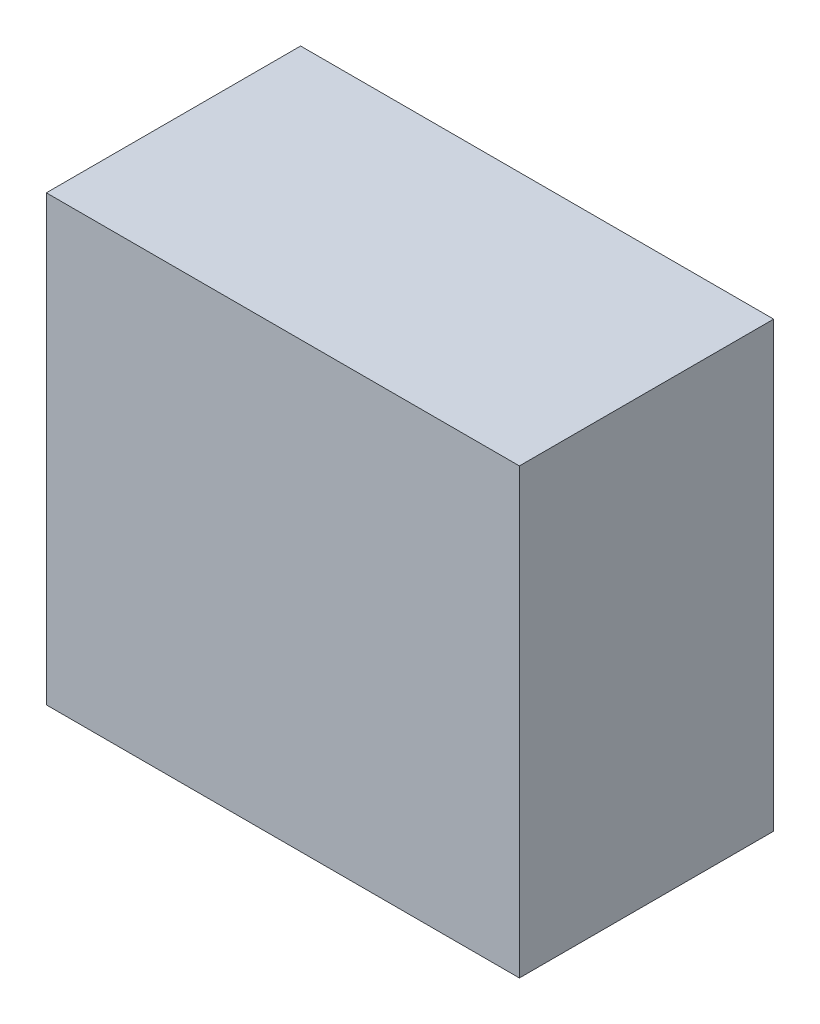
ISO-10303-21;
HEADER;
FILE_DESCRIPTION(('STEP AP214'),'2;1');
FILE_NAME('part.step','',(''),(''),'','','');
FILE_SCHEMA(('AUTOMOTIVE_DESIGN { 1 0 10303 214 1 1 1 1 }'));
ENDSEC;
DATA;
#1=APPLICATION_CONTEXT('core data for automotive mechanical design processes');
#2=APPLICATION_PROTOCOL_DEFINITION('international standard','automotive_design',2000,#1);
#3=PRODUCT_CONTEXT('',#1,'mechanical');
#4=PRODUCT('Part','Part','',(#3));
#5=PRODUCT_RELATED_PRODUCT_CATEGORY('part','',(#4));
#6=PRODUCT_DEFINITION_FORMATION('','',#4);
#7=PRODUCT_DEFINITION_CONTEXT('part definition',#1,'design');
#8=PRODUCT_DEFINITION('design','',#6,#7);
#9=PRODUCT_DEFINITION_SHAPE('','',#8);
#10=(LENGTH_UNIT() NAMED_UNIT(*) SI_UNIT(.MILLI.,.METRE.));
#11=(NAMED_UNIT(*) PLANE_ANGLE_UNIT() SI_UNIT($,.RADIAN.));
#12=(NAMED_UNIT(*) SI_UNIT($,.STERADIAN.) SOLID_ANGLE_UNIT());
#13=UNCERTAINTY_MEASURE_WITH_UNIT(LENGTH_MEASURE(1.E-05),#10,'distance_accuracy_value','');
#14=(GEOMETRIC_REPRESENTATION_CONTEXT(3) GLOBAL_UNCERTAINTY_ASSIGNED_CONTEXT((#13)) GLOBAL_UNIT_ASSIGNED_CONTEXT((#10,
#11,#12)) REPRESENTATION_CONTEXT('',''));
#15=CARTESIAN_POINT('',(0.,0.,0.));
#16=DIRECTION('',(0.,0.,1.));
#17=DIRECTION('',(1.,0.,0.));
#18=AXIS2_PLACEMENT_3D('',#15,#16,#17);
#19=CARTESIAN_POINT('',(160.,300.,86.));
#20=DIRECTION('',(-1.,0.,0.));
#21=DIRECTION('',(0.,0.,1.));
#22=AXIS2_PLACEMENT_3D('',#19,#20,#21);
#23=PLANE('',#22);
#24=DIRECTION('',(0.,0.,-1.));
#25=VECTOR('',#24,1.);
#26=CARTESIAN_POINT('',(160.,0.,86.));
#27=LINE('',#26,#25);
#28=CARTESIAN_POINT('',(160.,0.,86.));
#29=VERTEX_POINT('',#28);
#30=CARTESIAN_POINT('',(160.,0.,-86.));
#31=VERTEX_POINT('',#30);
#32=EDGE_CURVE('E107',#29,#31,#27,.T.);
#33=ORIENTED_EDGE('',*,*,#32,.T.);
#34=DIRECTION('',(0.,-1.,0.));
#35=VECTOR('',#34,1.);
#36=CARTESIAN_POINT('',(160.,300.,-86.));
#37=LINE('',#36,#35);
#38=CARTESIAN_POINT('',(160.,300.,-86.));
#39=VERTEX_POINT('',#38);
#40=EDGE_CURVE('E11',#39,#31,#37,.T.);
#41=ORIENTED_EDGE('',*,*,#40,.F.);
#42=DIRECTION('',(0.,0.,-1.));
#43=VECTOR('',#42,1.);
#44=CARTESIAN_POINT('',(160.,300.,86.));
#45=LINE('',#44,#43);
#46=CARTESIAN_POINT('',(160.,300.,86.));
#47=VERTEX_POINT('',#46);
#48=EDGE_CURVE('E91',#47,#39,#45,.T.);
#49=ORIENTED_EDGE('',*,*,#48,.F.);
#50=DIRECTION('',(0.,-1.,0.));
#51=VECTOR('',#50,1.);
#52=CARTESIAN_POINT('',(160.,300.,86.));
#53=LINE('',#52,#51);
#54=EDGE_CURVE('E103',#47,#29,#53,.T.);
#55=ORIENTED_EDGE('',*,*,#54,.T.);
#56=EDGE_LOOP('',(#33,#41,#49,#55));
#57=FACE_BOUND('',#56,.T.);
#58=ADVANCED_FACE('F39',(#57),#23,.F.);
#59=CARTESIAN_POINT('',(-160.,300.,-86.));
#60=DIRECTION('',(0.,0.,1.));
#61=DIRECTION('',(1.,0.,0.));
#62=AXIS2_PLACEMENT_3D('',#59,#60,#61);
#63=PLANE('',#62);
#64=DIRECTION('',(-1.,0.,0.));
#65=VECTOR('',#64,1.);
#66=CARTESIAN_POINT('',(-160.,0.,-86.));
#67=LINE('',#66,#65);
#68=CARTESIAN_POINT('',(-160.,0.,-86.));
#69=VERTEX_POINT('',#68);
#70=EDGE_CURVE('E96',#31,#69,#67,.T.);
#71=ORIENTED_EDGE('',*,*,#70,.T.);
#72=DIRECTION('',(0.,-1.,0.));
#73=VECTOR('',#72,1.);
#74=CARTESIAN_POINT('',(-160.,300.,-86.));
#75=LINE('',#74,#73);
#76=CARTESIAN_POINT('',(-160.,300.,-86.));
#77=VERTEX_POINT('',#76);
#78=EDGE_CURVE('E48',#77,#69,#75,.T.);
#79=ORIENTED_EDGE('',*,*,#78,.F.);
#80=DIRECTION('',(-1.,0.,0.));
#81=VECTOR('',#80,1.);
#82=CARTESIAN_POINT('',(-160.,300.,-86.));
#83=LINE('',#82,#81);
#84=EDGE_CURVE('E86',#39,#77,#83,.T.);
#85=ORIENTED_EDGE('',*,*,#84,.F.);
#86=ORIENTED_EDGE('',*,*,#40,.T.);
#87=EDGE_LOOP('',(#71,#79,#85,#86));
#88=FACE_BOUND('',#87,.T.);
#89=ADVANCED_FACE('F95',(#88),#63,.F.);
#90=CARTESIAN_POINT('',(-160.,300.,86.));
#91=DIRECTION('',(1.,0.,0.));
#92=DIRECTION('',(0.,0.,-1.));
#93=AXIS2_PLACEMENT_3D('',#90,#91,#92);
#94=PLANE('',#93);
#95=DIRECTION('',(0.,0.,1.));
#96=VECTOR('',#95,1.);
#97=CARTESIAN_POINT('',(-160.,0.,86.));
#98=LINE('',#97,#96);
#99=CARTESIAN_POINT('',(-160.,0.,86.));
#100=VERTEX_POINT('',#99);
#101=EDGE_CURVE('E73',#69,#100,#98,.T.);
#102=ORIENTED_EDGE('',*,*,#101,.T.);
#103=DIRECTION('',(0.,-1.,0.));
#104=VECTOR('',#103,1.);
#105=CARTESIAN_POINT('',(-160.,300.,86.));
#106=LINE('',#105,#104);
#107=CARTESIAN_POINT('',(-160.,300.,86.));
#108=VERTEX_POINT('',#107);
#109=EDGE_CURVE('E98',#108,#100,#106,.T.);
#110=ORIENTED_EDGE('',*,*,#109,.F.);
#111=DIRECTION('',(0.,0.,1.));
#112=VECTOR('',#111,1.);
#113=CARTESIAN_POINT('',(-160.,300.,86.));
#114=LINE('',#113,#112);
#115=EDGE_CURVE('E89',#77,#108,#114,.T.);
#116=ORIENTED_EDGE('',*,*,#115,.F.);
#117=ORIENTED_EDGE('',*,*,#78,.T.);
#118=EDGE_LOOP('',(#102,#110,#116,#117));
#119=FACE_BOUND('',#118,.T.);
#120=ADVANCED_FACE('F99',(#119),#94,.F.);
#121=CARTESIAN_POINT('',(-160.,300.,86.));
#122=DIRECTION('',(0.,0.,-1.));
#123=DIRECTION('',(-1.,0.,0.));
#124=AXIS2_PLACEMENT_3D('',#121,#122,#123);
#125=PLANE('',#124);
#126=DIRECTION('',(1.,0.,0.));
#127=VECTOR('',#126,1.);
#128=CARTESIAN_POINT('',(-160.,0.,86.));
#129=LINE('',#128,#127);
#130=EDGE_CURVE('E79',#100,#29,#129,.T.);
#131=ORIENTED_EDGE('',*,*,#130,.T.);
#132=ORIENTED_EDGE('',*,*,#54,.F.);
#133=DIRECTION('',(1.,0.,0.));
#134=VECTOR('',#133,1.);
#135=CARTESIAN_POINT('',(-160.,300.,86.));
#136=LINE('',#135,#134);
#137=EDGE_CURVE('E56',#108,#47,#136,.T.);
#138=ORIENTED_EDGE('',*,*,#137,.F.);
#139=ORIENTED_EDGE('',*,*,#109,.T.);
#140=EDGE_LOOP('',(#131,#132,#138,#139));
#141=FACE_BOUND('',#140,.T.);
#142=ADVANCED_FACE('F120',(#141),#125,.F.);
#143=CARTESIAN_POINT('',(0.,300.,0.));
#144=DIRECTION('',(0.,-1.,0.));
#145=DIRECTION('',(0.,0.,-1.));
#146=AXIS2_PLACEMENT_3D('',#143,#144,#145);
#147=PLANE('',#146);
#148=ORIENTED_EDGE('',*,*,#48,.T.);
#149=ORIENTED_EDGE('',*,*,#84,.T.);
#150=ORIENTED_EDGE('',*,*,#115,.T.);
#151=ORIENTED_EDGE('',*,*,#137,.T.);
#152=EDGE_LOOP('',(#148,#149,#150,#151));
#153=FACE_BOUND('',#152,.T.);
#154=ADVANCED_FACE('F87',(#153),#147,.F.);
#155=CARTESIAN_POINT('',(0.,0.,0.));
#156=DIRECTION('',(0.,-1.,0.));
#157=DIRECTION('',(0.,0.,-1.));
#158=AXIS2_PLACEMENT_3D('',#155,#156,#157);
#159=PLANE('',#158);
#160=ORIENTED_EDGE('',*,*,#32,.F.);
#161=ORIENTED_EDGE('',*,*,#130,.F.);
#162=ORIENTED_EDGE('',*,*,#101,.F.);
#163=ORIENTED_EDGE('',*,*,#70,.F.);
#164=EDGE_LOOP('',(#160,#161,#162,#163));
#165=FACE_BOUND('',#164,.T.);
#166=ADVANCED_FACE('F123',(#165),#159,.T.);
#167=CLOSED_SHELL('',(#58,#89,#120,#142,#154,#166));
#168=MANIFOLD_SOLID_BREP('B2',#167);
#169=ADVANCED_BREP_SHAPE_REPRESENTATION('',(#18,#168),#14);
#170=SHAPE_DEFINITION_REPRESENTATION(#9,#169);
ENDSEC;
END-ISO-10303-21;
